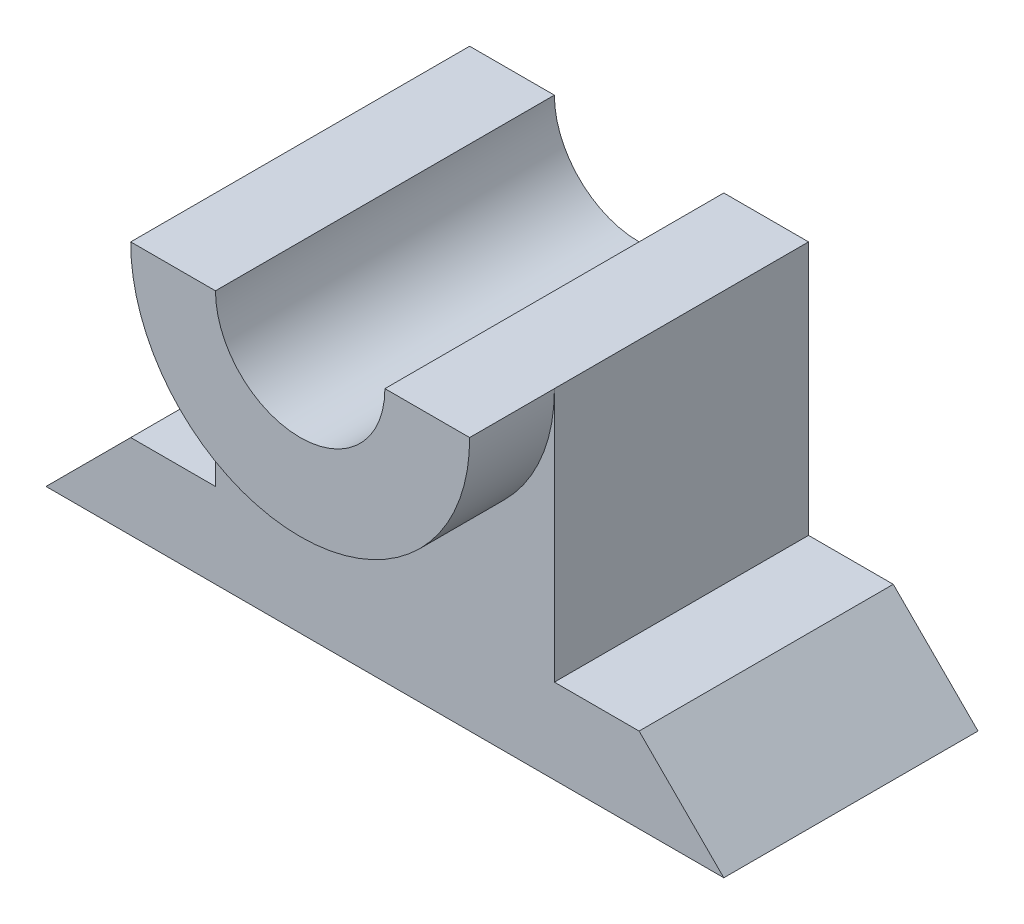
ISO-10303-21;
HEADER;
FILE_DESCRIPTION(('STEP AP214'),'2;1');
FILE_NAME('part.step','',(''),(''),'','','');
FILE_SCHEMA(('AUTOMOTIVE_DESIGN { 1 0 10303 214 1 1 1 1 }'));
ENDSEC;
DATA;
#1=APPLICATION_CONTEXT('core data for automotive mechanical design processes');
#2=APPLICATION_PROTOCOL_DEFINITION('international standard','automotive_design',2000,#1);
#3=PRODUCT_CONTEXT('',#1,'mechanical');
#4=PRODUCT('Part','Part','',(#3));
#5=PRODUCT_RELATED_PRODUCT_CATEGORY('part','',(#4));
#6=PRODUCT_DEFINITION_FORMATION('','',#4);
#7=PRODUCT_DEFINITION_CONTEXT('part definition',#1,'design');
#8=PRODUCT_DEFINITION('design','',#6,#7);
#9=PRODUCT_DEFINITION_SHAPE('','',#8);
#10=(LENGTH_UNIT() NAMED_UNIT(*) SI_UNIT(.MILLI.,.METRE.));
#11=(NAMED_UNIT(*) PLANE_ANGLE_UNIT() SI_UNIT($,.RADIAN.));
#12=(NAMED_UNIT(*) SI_UNIT($,.STERADIAN.) SOLID_ANGLE_UNIT());
#13=UNCERTAINTY_MEASURE_WITH_UNIT(LENGTH_MEASURE(1.E-05),#10,'distance_accuracy_value','');
#14=(GEOMETRIC_REPRESENTATION_CONTEXT(3) GLOBAL_UNCERTAINTY_ASSIGNED_CONTEXT((#13)) GLOBAL_UNIT_ASSIGNED_CONTEXT((#10,
#11,#12)) REPRESENTATION_CONTEXT('',''));
#15=CARTESIAN_POINT('',(0.,0.,0.));
#16=DIRECTION('',(0.,0.,1.));
#17=DIRECTION('',(1.,0.,0.));
#18=AXIS2_PLACEMENT_3D('',#15,#16,#17);
#19=CARTESIAN_POINT('',(20.,40.,30.));
#20=DIRECTION('',(0.,-1.,0.));
#21=DIRECTION('',(1.,0.,0.));
#22=AXIS2_PLACEMENT_3D('',#19,#20,#21);
#23=PLANE('',#22);
#24=DIRECTION('',(-1.,0.,0.));
#25=VECTOR('',#24,1.);
#26=CARTESIAN_POINT('',(20.,40.,0.));
#27=LINE('',#26,#25);
#28=CARTESIAN_POINT('',(20.,40.,0.));
#29=VERTEX_POINT('',#28);
#30=CARTESIAN_POINT('',(10.,40.,0.));
#31=VERTEX_POINT('',#30);
#32=EDGE_CURVE('E135',#29,#31,#27,.T.);
#33=ORIENTED_EDGE('',*,*,#32,.T.);
#34=DIRECTION('',(0.,0.,1.));
#35=VECTOR('',#34,1.);
#36=CARTESIAN_POINT('',(10.,40.,-30.));
#37=LINE('',#36,#35);
#38=CARTESIAN_POINT('',(10.,40.,40.));
#39=VERTEX_POINT('',#38);
#40=EDGE_CURVE('E122',#31,#39,#37,.T.);
#41=ORIENTED_EDGE('',*,*,#40,.T.);
#42=DIRECTION('',(-1.,0.,0.));
#43=VECTOR('',#42,1.);
#44=CARTESIAN_POINT('',(-20.,40.,40.));
#45=LINE('',#44,#43);
#46=CARTESIAN_POINT('',(20.,40.,40.));
#47=VERTEX_POINT('',#46);
#48=EDGE_CURVE('E131',#47,#39,#45,.T.);
#49=ORIENTED_EDGE('',*,*,#48,.F.);
#50=DIRECTION('',(0.,0.,-1.));
#51=VECTOR('',#50,1.);
#52=CARTESIAN_POINT('',(20.,40.,40.));
#53=LINE('',#52,#51);
#54=CARTESIAN_POINT('',(20.,40.,30.));
#55=VERTEX_POINT('',#54);
#56=EDGE_CURVE('E145',#47,#55,#53,.T.);
#57=ORIENTED_EDGE('',*,*,#56,.T.);
#58=DIRECTION('',(0.,0.,-1.));
#59=VECTOR('',#58,1.);
#60=CARTESIAN_POINT('',(20.,40.,30.));
#61=LINE('',#60,#59);
#62=EDGE_CURVE('E249',#55,#29,#61,.T.);
#63=ORIENTED_EDGE('',*,*,#62,.T.);
#64=EDGE_LOOP('',(#33,#41,#49,#57,#63));
#65=FACE_BOUND('',#64,.T.);
#66=ADVANCED_FACE('F33',(#65),#23,.F.);
#67=CARTESIAN_POINT('',(40.,0.,30.));
#68=DIRECTION('',(-0.707106781186547,-0.707106781186547,0.));
#69=DIRECTION('',(0.707106781186548,-0.707106781186548,0.));
#70=AXIS2_PLACEMENT_3D('',#67,#68,#69);
#71=PLANE('',#70);
#72=DIRECTION('',(-0.707106781186548,0.707106781186548,0.));
#73=VECTOR('',#72,1.);
#74=CARTESIAN_POINT('',(40.,0.,0.));
#75=LINE('',#74,#73);
#76=CARTESIAN_POINT('',(40.,0.,0.));
#77=VERTEX_POINT('',#76);
#78=CARTESIAN_POINT('',(30.,10.,0.));
#79=VERTEX_POINT('',#78);
#80=EDGE_CURVE('E308',#77,#79,#75,.T.);
#81=ORIENTED_EDGE('',*,*,#80,.T.);
#82=DIRECTION('',(0.,0.,-1.));
#83=VECTOR('',#82,1.);
#84=CARTESIAN_POINT('',(30.,10.,30.));
#85=LINE('',#84,#83);
#86=CARTESIAN_POINT('',(30.,10.,30.));
#87=VERTEX_POINT('',#86);
#88=EDGE_CURVE('E42',#87,#79,#85,.T.);
#89=ORIENTED_EDGE('',*,*,#88,.F.);
#90=DIRECTION('',(-0.707106781186548,0.707106781186548,0.));
#91=VECTOR('',#90,1.);
#92=CARTESIAN_POINT('',(40.,0.,30.));
#93=LINE('',#92,#91);
#94=CARTESIAN_POINT('',(40.,0.,30.));
#95=VERTEX_POINT('',#94);
#96=EDGE_CURVE('E232',#95,#87,#93,.T.);
#97=ORIENTED_EDGE('',*,*,#96,.F.);
#98=DIRECTION('',(0.,0.,-1.));
#99=VECTOR('',#98,1.);
#100=CARTESIAN_POINT('',(40.,0.,30.));
#101=LINE('',#100,#99);
#102=EDGE_CURVE('E233',#95,#77,#101,.T.);
#103=ORIENTED_EDGE('',*,*,#102,.T.);
#104=EDGE_LOOP('',(#81,#89,#97,#103));
#105=FACE_BOUND('',#104,.T.);
#106=ADVANCED_FACE('F35',(#105),#71,.F.);
#107=CARTESIAN_POINT('',(30.,10.,30.));
#108=DIRECTION('',(0.,-1.,0.));
#109=DIRECTION('',(1.,0.,0.));
#110=AXIS2_PLACEMENT_3D('',#107,#108,#109);
#111=PLANE('',#110);
#112=DIRECTION('',(-1.,0.,0.));
#113=VECTOR('',#112,1.);
#114=CARTESIAN_POINT('',(30.,10.,0.));
#115=LINE('',#114,#113);
#116=CARTESIAN_POINT('',(20.,10.,0.));
#117=VERTEX_POINT('',#116);
#118=EDGE_CURVE('E221',#79,#117,#115,.T.);
#119=ORIENTED_EDGE('',*,*,#118,.T.);
#120=DIRECTION('',(0.,0.,-1.));
#121=VECTOR('',#120,1.);
#122=CARTESIAN_POINT('',(20.,10.,30.));
#123=LINE('',#122,#121);
#124=CARTESIAN_POINT('',(20.,10.,30.));
#125=VERTEX_POINT('',#124);
#126=EDGE_CURVE('E246',#125,#117,#123,.T.);
#127=ORIENTED_EDGE('',*,*,#126,.F.);
#128=DIRECTION('',(-1.,0.,0.));
#129=VECTOR('',#128,1.);
#130=CARTESIAN_POINT('',(30.,10.,30.));
#131=LINE('',#130,#129);
#132=EDGE_CURVE('E301',#87,#125,#131,.T.);
#133=ORIENTED_EDGE('',*,*,#132,.F.);
#134=ORIENTED_EDGE('',*,*,#88,.T.);
#135=EDGE_LOOP('',(#119,#127,#133,#134));
#136=FACE_BOUND('',#135,.T.);
#137=ADVANCED_FACE('F183',(#136),#111,.F.);
#138=CARTESIAN_POINT('',(20.,10.,30.));
#139=DIRECTION('',(-1.,0.,0.));
#140=DIRECTION('',(0.,0.,1.));
#141=AXIS2_PLACEMENT_3D('',#138,#139,#140);
#142=PLANE('',#141);
#143=DIRECTION('',(0.,1.,0.));
#144=VECTOR('',#143,1.);
#145=CARTESIAN_POINT('',(20.,10.,0.));
#146=LINE('',#145,#144);
#147=EDGE_CURVE('E219',#117,#29,#146,.T.);
#148=ORIENTED_EDGE('',*,*,#147,.T.);
#149=ORIENTED_EDGE('',*,*,#62,.F.);
#150=CARTESIAN_POINT('',(0.,39.8722742829224,30.));
#151=DIRECTION('',(0.,0.,1.));
#152=DIRECTION('',(0.999979608300245,-0.00638615562665324,0.));
#153=AXIS2_PLACEMENT_3D('',#150,#151,#152);
#154=CIRCLE('',#153,20.0004078423117);
#155=CARTESIAN_POINT('',(20.,39.7445485658449,30.));
#156=VERTEX_POINT('',#155);
#157=EDGE_CURVE('E167',#156,#55,#154,.T.);
#158=ORIENTED_EDGE('',*,*,#157,.F.);
#159=DIRECTION('',(0.,1.,0.));
#160=VECTOR('',#159,1.);
#161=CARTESIAN_POINT('',(20.,10.,30.));
#162=LINE('',#161,#160);
#163=EDGE_CURVE('E159',#125,#156,#162,.T.);
#164=ORIENTED_EDGE('',*,*,#163,.F.);
#165=ORIENTED_EDGE('',*,*,#126,.T.);
#166=EDGE_LOOP('',(#148,#149,#158,#164,#165));
#167=FACE_BOUND('',#166,.T.);
#168=ADVANCED_FACE('F173',(#167),#142,.F.);
#169=CARTESIAN_POINT('',(-10.,40.,40.));
#170=VERTEX_POINT('',#169);
#171=CARTESIAN_POINT('',(-20.,40.,40.));
#172=VERTEX_POINT('',#171);
#173=EDGE_CURVE('E142',#170,#172,#45,.T.);
#174=ORIENTED_EDGE('',*,*,#173,.F.);
#175=DIRECTION('',(0.,0.,1.));
#176=VECTOR('',#175,1.);
#177=CARTESIAN_POINT('',(-10.,40.,-30.));
#178=LINE('',#177,#176);
#179=CARTESIAN_POINT('',(-10.,40.,0.));
#180=VERTEX_POINT('',#179);
#181=EDGE_CURVE('E50',#180,#170,#178,.T.);
#182=ORIENTED_EDGE('',*,*,#181,.F.);
#183=CARTESIAN_POINT('',(-20.,40.,0.));
#184=VERTEX_POINT('',#183);
#185=EDGE_CURVE('E216',#180,#184,#27,.T.);
#186=ORIENTED_EDGE('',*,*,#185,.T.);
#187=DIRECTION('',(0.,0.,-1.));
#188=VECTOR('',#187,1.);
#189=CARTESIAN_POINT('',(-20.,40.,30.));
#190=LINE('',#189,#188);
#191=CARTESIAN_POINT('',(-20.,40.,30.));
#192=VERTEX_POINT('',#191);
#193=EDGE_CURVE('E205',#192,#184,#190,.T.);
#194=ORIENTED_EDGE('',*,*,#193,.F.);
#195=DIRECTION('',(0.,0.,-1.));
#196=VECTOR('',#195,1.);
#197=CARTESIAN_POINT('',(-20.,40.,40.));
#198=LINE('',#197,#196);
#199=EDGE_CURVE('E141',#172,#192,#198,.T.);
#200=ORIENTED_EDGE('',*,*,#199,.F.);
#201=EDGE_LOOP('',(#174,#182,#186,#194,#200));
#202=FACE_BOUND('',#201,.T.);
#203=ADVANCED_FACE('F182',(#202),#23,.F.);
#204=CARTESIAN_POINT('',(-20.,9.99999999999999,30.));
#205=DIRECTION('',(1.,0.,0.));
#206=DIRECTION('',(0.,0.,-1.));
#207=AXIS2_PLACEMENT_3D('',#204,#205,#206);
#208=PLANE('',#207);
#209=DIRECTION('',(0.,-1.,0.));
#210=VECTOR('',#209,1.);
#211=CARTESIAN_POINT('',(-20.,9.99999999999999,0.));
#212=LINE('',#211,#210);
#213=CARTESIAN_POINT('',(-20.,9.99999999999999,0.));
#214=VERTEX_POINT('',#213);
#215=EDGE_CURVE('E218',#184,#214,#212,.T.);
#216=ORIENTED_EDGE('',*,*,#215,.T.);
#217=DIRECTION('',(0.,0.,-1.));
#218=VECTOR('',#217,1.);
#219=CARTESIAN_POINT('',(-20.,9.99999999999999,30.));
#220=LINE('',#219,#218);
#221=CARTESIAN_POINT('',(-20.,9.99999999999999,30.));
#222=VERTEX_POINT('',#221);
#223=EDGE_CURVE('E243',#222,#214,#220,.T.);
#224=ORIENTED_EDGE('',*,*,#223,.F.);
#225=DIRECTION('',(0.,-1.,0.));
#226=VECTOR('',#225,1.);
#227=CARTESIAN_POINT('',(-20.,9.99999999999999,30.));
#228=LINE('',#227,#226);
#229=CARTESIAN_POINT('',(-20.,39.7445485658443,30.));
#230=VERTEX_POINT('',#229);
#231=EDGE_CURVE('E156',#230,#222,#228,.T.);
#232=ORIENTED_EDGE('',*,*,#231,.F.);
#233=CARTESIAN_POINT('',(0.,39.8722742829224,30.));
#234=DIRECTION('',(0.,0.,1.));
#235=DIRECTION('',(-0.999979608300245,0.00638615562665428,0.));
#236=AXIS2_PLACEMENT_3D('',#233,#234,#235);
#237=CIRCLE('',#236,20.0004078423117);
#238=EDGE_CURVE('E158',#192,#230,#237,.T.);
#239=ORIENTED_EDGE('',*,*,#238,.F.);
#240=ORIENTED_EDGE('',*,*,#193,.T.);
#241=EDGE_LOOP('',(#216,#224,#232,#239,#240));
#242=FACE_BOUND('',#241,.T.);
#243=ADVANCED_FACE('F195',(#242),#208,.F.);
#244=CARTESIAN_POINT('',(-30.,9.99999999999999,30.));
#245=DIRECTION('',(0.,-1.,0.));
#246=DIRECTION('',(1.,0.,0.));
#247=AXIS2_PLACEMENT_3D('',#244,#245,#246);
#248=PLANE('',#247);
#249=DIRECTION('',(-1.,0.,0.));
#250=VECTOR('',#249,1.);
#251=CARTESIAN_POINT('',(-30.,9.99999999999999,0.));
#252=LINE('',#251,#250);
#253=CARTESIAN_POINT('',(-30.,9.99999999999999,0.));
#254=VERTEX_POINT('',#253);
#255=EDGE_CURVE('E226',#214,#254,#252,.T.);
#256=ORIENTED_EDGE('',*,*,#255,.T.);
#257=DIRECTION('',(0.,0.,-1.));
#258=VECTOR('',#257,1.);
#259=CARTESIAN_POINT('',(-30.,9.99999999999999,30.));
#260=LINE('',#259,#258);
#261=CARTESIAN_POINT('',(-30.,9.99999999999999,30.));
#262=VERTEX_POINT('',#261);
#263=EDGE_CURVE('E240',#262,#254,#260,.T.);
#264=ORIENTED_EDGE('',*,*,#263,.F.);
#265=DIRECTION('',(-1.,0.,0.));
#266=VECTOR('',#265,1.);
#267=CARTESIAN_POINT('',(-30.,9.99999999999999,30.));
#268=LINE('',#267,#266);
#269=EDGE_CURVE('E303',#222,#262,#268,.T.);
#270=ORIENTED_EDGE('',*,*,#269,.F.);
#271=ORIENTED_EDGE('',*,*,#223,.T.);
#272=EDGE_LOOP('',(#256,#264,#270,#271));
#273=FACE_BOUND('',#272,.T.);
#274=ADVANCED_FACE('F200',(#273),#248,.F.);
#275=CARTESIAN_POINT('',(-40.,0.,30.));
#276=DIRECTION('',(0.707106781186547,-0.707106781186548,0.));
#277=DIRECTION('',(0.707106781186548,0.707106781186547,0.));
#278=AXIS2_PLACEMENT_3D('',#275,#276,#277);
#279=PLANE('',#278);
#280=DIRECTION('',(-0.707106781186548,-0.707106781186547,0.));
#281=VECTOR('',#280,1.);
#282=CARTESIAN_POINT('',(-40.,0.,0.));
#283=LINE('',#282,#281);
#284=CARTESIAN_POINT('',(-40.,0.,0.));
#285=VERTEX_POINT('',#284);
#286=EDGE_CURVE('E228',#254,#285,#283,.T.);
#287=ORIENTED_EDGE('',*,*,#286,.T.);
#288=DIRECTION('',(0.,0.,-1.));
#289=VECTOR('',#288,1.);
#290=CARTESIAN_POINT('',(-40.,0.,30.));
#291=LINE('',#290,#289);
#292=CARTESIAN_POINT('',(-40.,0.,30.));
#293=VERTEX_POINT('',#292);
#294=EDGE_CURVE('E236',#293,#285,#291,.T.);
#295=ORIENTED_EDGE('',*,*,#294,.F.);
#296=DIRECTION('',(-0.707106781186548,-0.707106781186547,0.));
#297=VECTOR('',#296,1.);
#298=CARTESIAN_POINT('',(-40.,0.,30.));
#299=LINE('',#298,#297);
#300=EDGE_CURVE('E305',#262,#293,#299,.T.);
#301=ORIENTED_EDGE('',*,*,#300,.F.);
#302=ORIENTED_EDGE('',*,*,#263,.T.);
#303=EDGE_LOOP('',(#287,#295,#301,#302));
#304=FACE_BOUND('',#303,.T.);
#305=ADVANCED_FACE('F264',(#304),#279,.F.);
#306=CARTESIAN_POINT('',(-40.,0.,30.));
#307=DIRECTION('',(0.,1.,0.));
#308=DIRECTION('',(0.,0.,1.));
#309=AXIS2_PLACEMENT_3D('',#306,#307,#308);
#310=PLANE('',#309);
#311=DIRECTION('',(1.,0.,0.));
#312=VECTOR('',#311,1.);
#313=CARTESIAN_POINT('',(-40.,0.,0.));
#314=LINE('',#313,#312);
#315=EDGE_CURVE('E230',#285,#77,#314,.T.);
#316=ORIENTED_EDGE('',*,*,#315,.T.);
#317=ORIENTED_EDGE('',*,*,#102,.F.);
#318=DIRECTION('',(1.,0.,0.));
#319=VECTOR('',#318,1.);
#320=CARTESIAN_POINT('',(-40.,0.,30.));
#321=LINE('',#320,#319);
#322=EDGE_CURVE('E237',#293,#95,#321,.T.);
#323=ORIENTED_EDGE('',*,*,#322,.F.);
#324=ORIENTED_EDGE('',*,*,#294,.T.);
#325=EDGE_LOOP('',(#316,#317,#323,#324));
#326=FACE_BOUND('',#325,.T.);
#327=ADVANCED_FACE('F268',(#326),#310,.F.);
#328=CARTESIAN_POINT('',(0.,0.,30.));
#329=DIRECTION('',(0.,0.,-1.));
#330=DIRECTION('',(-1.,0.,0.));
#331=AXIS2_PLACEMENT_3D('',#328,#329,#330);
#332=PLANE('',#331);
#333=CARTESIAN_POINT('',(0.,39.8722742829224,30.));
#334=DIRECTION('',(0.,0.,1.));
#335=DIRECTION('',(1.,0.,0.));
#336=AXIS2_PLACEMENT_3D('',#333,#334,#335);
#337=CIRCLE('',#336,20.0004078423117);
#338=EDGE_CURVE('E11',#230,#156,#337,.T.);
#339=ORIENTED_EDGE('',*,*,#338,.F.);
#340=ORIENTED_EDGE('',*,*,#231,.T.);
#341=ORIENTED_EDGE('',*,*,#269,.T.);
#342=ORIENTED_EDGE('',*,*,#300,.T.);
#343=ORIENTED_EDGE('',*,*,#322,.T.);
#344=ORIENTED_EDGE('',*,*,#96,.T.);
#345=ORIENTED_EDGE('',*,*,#132,.T.);
#346=ORIENTED_EDGE('',*,*,#163,.T.);
#347=EDGE_LOOP('',(#339,#340,#341,#342,#343,#344,#345,#346));
#348=FACE_BOUND('',#347,.T.);
#349=ADVANCED_FACE('F272',(#348),#332,.F.);
#350=CARTESIAN_POINT('',(0.,0.,0.));
#351=DIRECTION('',(0.,0.,-1.));
#352=DIRECTION('',(-1.,0.,0.));
#353=AXIS2_PLACEMENT_3D('',#350,#351,#352);
#354=PLANE('',#353);
#355=CARTESIAN_POINT('',(0.,40.,0.));
#356=DIRECTION('',(0.,0.,-1.));
#357=DIRECTION('',(-1.,0.,0.));
#358=AXIS2_PLACEMENT_3D('',#355,#356,#357);
#359=CIRCLE('',#358,10.);
#360=EDGE_CURVE('E210',#31,#180,#359,.T.);
#361=ORIENTED_EDGE('',*,*,#360,.F.);
#362=ORIENTED_EDGE('',*,*,#32,.F.);
#363=ORIENTED_EDGE('',*,*,#147,.F.);
#364=ORIENTED_EDGE('',*,*,#118,.F.);
#365=ORIENTED_EDGE('',*,*,#80,.F.);
#366=ORIENTED_EDGE('',*,*,#315,.F.);
#367=ORIENTED_EDGE('',*,*,#286,.F.);
#368=ORIENTED_EDGE('',*,*,#255,.F.);
#369=ORIENTED_EDGE('',*,*,#215,.F.);
#370=ORIENTED_EDGE('',*,*,#185,.F.);
#371=EDGE_LOOP('',(#361,#362,#363,#364,#365,#366,#367,#368,#369,#370));
#372=FACE_BOUND('',#371,.T.);
#373=ADVANCED_FACE('F213',(#372),#354,.T.);
#374=CARTESIAN_POINT('',(0.,39.8722742829224,40.));
#375=DIRECTION('',(0.,0.,-1.));
#376=DIRECTION('',(-1.,0.,0.));
#377=AXIS2_PLACEMENT_3D('',#374,#375,#376);
#378=CYLINDRICAL_SURFACE('',#377,20.0004078423117);
#379=ORIENTED_EDGE('',*,*,#238,.T.);
#380=ORIENTED_EDGE('',*,*,#338,.T.);
#381=ORIENTED_EDGE('',*,*,#157,.T.);
#382=ORIENTED_EDGE('',*,*,#56,.F.);
#383=CARTESIAN_POINT('',(0.,39.8722742829224,40.));
#384=DIRECTION('',(0.,0.,1.));
#385=DIRECTION('',(1.,0.,0.));
#386=AXIS2_PLACEMENT_3D('',#383,#384,#385);
#387=CIRCLE('',#386,20.0004078423117);
#388=EDGE_CURVE('E139',#172,#47,#387,.T.);
#389=ORIENTED_EDGE('',*,*,#388,.F.);
#390=ORIENTED_EDGE('',*,*,#199,.T.);
#391=EDGE_LOOP('',(#379,#380,#381,#382,#389,#390));
#392=FACE_BOUND('',#391,.T.);
#393=ADVANCED_FACE('F209',(#392),#378,.T.);
#394=CARTESIAN_POINT('',(0.,39.8722742829224,40.));
#395=DIRECTION('',(0.,0.,1.));
#396=DIRECTION('',(1.,0.,0.));
#397=AXIS2_PLACEMENT_3D('',#394,#395,#396);
#398=PLANE('',#397);
#399=CARTESIAN_POINT('',(0.,40.,40.));
#400=DIRECTION('',(0.,0.,1.));
#401=DIRECTION('',(1.,0.,0.));
#402=AXIS2_PLACEMENT_3D('',#399,#400,#401);
#403=CIRCLE('',#402,10.);
#404=EDGE_CURVE('E119',#170,#39,#403,.T.);
#405=ORIENTED_EDGE('',*,*,#404,.F.);
#406=ORIENTED_EDGE('',*,*,#173,.T.);
#407=ORIENTED_EDGE('',*,*,#388,.T.);
#408=ORIENTED_EDGE('',*,*,#48,.T.);
#409=EDGE_LOOP('',(#405,#406,#407,#408));
#410=FACE_BOUND('',#409,.T.);
#411=ADVANCED_FACE('F137',(#410),#398,.T.);
#412=CARTESIAN_POINT('',(0.,40.,-30.));
#413=DIRECTION('',(0.,0.,1.));
#414=DIRECTION('',(1.,0.,0.));
#415=AXIS2_PLACEMENT_3D('',#412,#413,#414);
#416=CYLINDRICAL_SURFACE('',#415,10.);
#417=ORIENTED_EDGE('',*,*,#360,.T.);
#418=ORIENTED_EDGE('',*,*,#181,.T.);
#419=ORIENTED_EDGE('',*,*,#404,.T.);
#420=ORIENTED_EDGE('',*,*,#40,.F.);
#421=EDGE_LOOP('',(#417,#418,#419,#420));
#422=FACE_BOUND('',#421,.T.);
#423=ADVANCED_FACE('F121',(#422),#416,.F.);
#424=CLOSED_SHELL('',(#66,#106,#137,#168,#203,#243,#274,#305,#327,#349,#373,#393,#411,#423));
#425=MANIFOLD_SOLID_BREP('B2',#424);
#426=ADVANCED_BREP_SHAPE_REPRESENTATION('',(#18,#425),#14);
#427=SHAPE_DEFINITION_REPRESENTATION(#9,#426);
ENDSEC;
END-ISO-10303-21;
